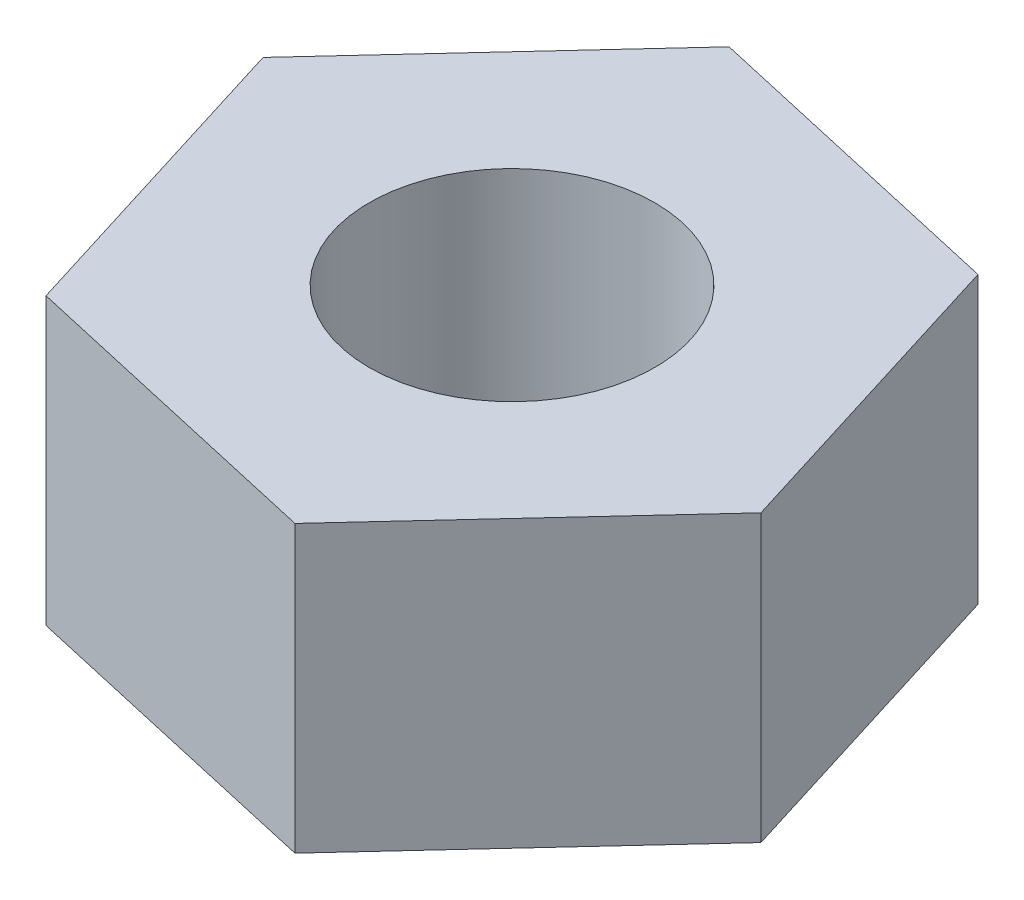
ISO-10303-21;
HEADER;
FILE_DESCRIPTION(('STEP AP214'),'2;1');
FILE_NAME('part.step','',(''),(''),'','','');
FILE_SCHEMA(('AUTOMOTIVE_DESIGN { 1 0 10303 214 1 1 1 1 }'));
ENDSEC;
DATA;
#1=APPLICATION_CONTEXT('core data for automotive mechanical design processes');
#2=APPLICATION_PROTOCOL_DEFINITION('international standard','automotive_design',2000,#1);
#3=PRODUCT_CONTEXT('',#1,'mechanical');
#4=PRODUCT('Part','Part','',(#3));
#5=PRODUCT_RELATED_PRODUCT_CATEGORY('part','',(#4));
#6=PRODUCT_DEFINITION_FORMATION('','',#4);
#7=PRODUCT_DEFINITION_CONTEXT('part definition',#1,'design');
#8=PRODUCT_DEFINITION('design','',#6,#7);
#9=PRODUCT_DEFINITION_SHAPE('','',#8);
#10=(LENGTH_UNIT() NAMED_UNIT(*) SI_UNIT(.MILLI.,.METRE.));
#11=(NAMED_UNIT(*) PLANE_ANGLE_UNIT() SI_UNIT($,.RADIAN.));
#12=(NAMED_UNIT(*) SI_UNIT($,.STERADIAN.) SOLID_ANGLE_UNIT());
#13=UNCERTAINTY_MEASURE_WITH_UNIT(LENGTH_MEASURE(1.E-05),#10,'distance_accuracy_value','');
#14=(GEOMETRIC_REPRESENTATION_CONTEXT(3) GLOBAL_UNCERTAINTY_ASSIGNED_CONTEXT((#13)) GLOBAL_UNIT_ASSIGNED_CONTEXT((#10,
#11,#12)) REPRESENTATION_CONTEXT('',''));
#15=CARTESIAN_POINT('',(0.,0.,0.));
#16=DIRECTION('',(0.,0.,1.));
#17=DIRECTION('',(1.,0.,0.));
#18=AXIS2_PLACEMENT_3D('',#15,#16,#17);
#19=CARTESIAN_POINT('',(-1.02792848073745,0.,-3.30807542817403));
#20=DIRECTION('',(0.220497439554603,0.,-0.97538755330887));
#21=DIRECTION('',(-0.97538755330887,0.,-0.220497439554603));
#22=AXIS2_PLACEMENT_3D('',#19,#20,#21);
#23=PLANE('',#22);
#24=DIRECTION('',(0.97538755330887,0.,0.220497439554603));
#25=VECTOR('',#24,1.);
#26=CARTESIAN_POINT('',(-1.02792848073745,-3.,-3.30807542817403));
#27=LINE('',#26,#25);
#28=CARTESIAN_POINT('',(-1.02792848073745,-3.,-3.30807542817403));
#29=VERTEX_POINT('',#28);
#30=CARTESIAN_POINT('',(2.35091311806507,-3.,-2.54424989167919));
#31=VERTEX_POINT('',#30);
#32=EDGE_CURVE('E118',#29,#31,#27,.T.);
#33=ORIENTED_EDGE('',*,*,#32,.F.);
#34=DIRECTION('',(0.,-1.,0.));
#35=VECTOR('',#34,1.);
#36=CARTESIAN_POINT('',(-1.02792848073745,0.,-3.30807542817403));
#37=LINE('',#36,#35);
#38=CARTESIAN_POINT('',(-1.02792848073745,0.,-3.30807542817403));
#39=VERTEX_POINT('',#38);
#40=EDGE_CURVE('E11',#39,#29,#37,.T.);
#41=ORIENTED_EDGE('',*,*,#40,.F.);
#42=DIRECTION('',(0.97538755330887,0.,0.220497439554603));
#43=VECTOR('',#42,1.);
#44=CARTESIAN_POINT('',(-1.02792848073745,0.,-3.30807542817403));
#45=LINE('',#44,#43);
#46=CARTESIAN_POINT('',(2.35091311806507,0.,-2.54424989167919));
#47=VERTEX_POINT('',#46);
#48=EDGE_CURVE('E133',#39,#47,#45,.T.);
#49=ORIENTED_EDGE('',*,*,#48,.T.);
#50=DIRECTION('',(0.,-1.,0.));
#51=VECTOR('',#50,1.);
#52=CARTESIAN_POINT('',(2.35091311806507,0.,-2.54424989167919));
#53=LINE('',#52,#51);
#54=EDGE_CURVE('E36',#47,#31,#53,.T.);
#55=ORIENTED_EDGE('',*,*,#54,.T.);
#56=EDGE_LOOP('',(#33,#41,#49,#55));
#57=FACE_BOUND('',#56,.T.);
#58=ADVANCED_FACE('F33',(#57),#23,.T.);
#59=CARTESIAN_POINT('',(-3.37884159880252,0.,-0.763825536494838));
#60=DIRECTION('',(-0.734461679923329,0.,-0.678650160778144));
#61=DIRECTION('',(-0.678650160778144,0.,0.734461679923329));
#62=AXIS2_PLACEMENT_3D('',#59,#60,#61);
#63=PLANE('',#62);
#64=DIRECTION('',(0.678650160778144,0.,-0.734461679923329));
#65=VECTOR('',#64,1.);
#66=CARTESIAN_POINT('',(-3.37884159880252,-3.,-0.763825536494838));
#67=LINE('',#66,#65);
#68=CARTESIAN_POINT('',(-3.37884159880252,-3.,-0.763825536494838));
#69=VERTEX_POINT('',#68);
#70=EDGE_CURVE('E131',#69,#29,#67,.T.);
#71=ORIENTED_EDGE('',*,*,#70,.F.);
#72=DIRECTION('',(0.,-1.,0.));
#73=VECTOR('',#72,1.);
#74=CARTESIAN_POINT('',(-3.37884159880252,0.,-0.763825536494838));
#75=LINE('',#74,#73);
#76=CARTESIAN_POINT('',(-3.37884159880252,0.,-0.763825536494838));
#77=VERTEX_POINT('',#76);
#78=EDGE_CURVE('E42',#77,#69,#75,.T.);
#79=ORIENTED_EDGE('',*,*,#78,.F.);
#80=DIRECTION('',(0.678650160778144,0.,-0.734461679923329));
#81=VECTOR('',#80,1.);
#82=CARTESIAN_POINT('',(-3.37884159880252,0.,-0.763825536494838));
#83=LINE('',#82,#81);
#84=EDGE_CURVE('E108',#77,#39,#83,.T.);
#85=ORIENTED_EDGE('',*,*,#84,.T.);
#86=ORIENTED_EDGE('',*,*,#40,.T.);
#87=EDGE_LOOP('',(#71,#79,#85,#86));
#88=FACE_BOUND('',#87,.T.);
#89=ADVANCED_FACE('F141',(#88),#63,.T.);
#90=CARTESIAN_POINT('',(-2.35091311806507,0.,2.54424989167919));
#91=DIRECTION('',(-0.954959119477931,0.,0.296737392530726));
#92=DIRECTION('',(0.296737392530726,0.,0.954959119477931));
#93=AXIS2_PLACEMENT_3D('',#90,#91,#92);
#94=PLANE('',#93);
#95=DIRECTION('',(-0.296737392530726,0.,-0.954959119477931));
#96=VECTOR('',#95,1.);
#97=CARTESIAN_POINT('',(-2.35091311806507,-3.,2.54424989167919));
#98=LINE('',#97,#96);
#99=CARTESIAN_POINT('',(-2.35091311806507,-3.,2.54424989167919));
#100=VERTEX_POINT('',#99);
#101=EDGE_CURVE('E95',#100,#69,#98,.T.);
#102=ORIENTED_EDGE('',*,*,#101,.F.);
#103=DIRECTION('',(0.,-1.,0.));
#104=VECTOR('',#103,1.);
#105=CARTESIAN_POINT('',(-2.35091311806507,0.,2.54424989167919));
#106=LINE('',#105,#104);
#107=CARTESIAN_POINT('',(-2.35091311806507,0.,2.54424989167919));
#108=VERTEX_POINT('',#107);
#109=EDGE_CURVE('E90',#108,#100,#106,.T.);
#110=ORIENTED_EDGE('',*,*,#109,.F.);
#111=DIRECTION('',(-0.296737392530726,0.,-0.954959119477931));
#112=VECTOR('',#111,1.);
#113=CARTESIAN_POINT('',(-2.35091311806507,0.,2.54424989167919));
#114=LINE('',#113,#112);
#115=EDGE_CURVE('E93',#108,#77,#114,.T.);
#116=ORIENTED_EDGE('',*,*,#115,.T.);
#117=ORIENTED_EDGE('',*,*,#78,.T.);
#118=EDGE_LOOP('',(#102,#110,#116,#117));
#119=FACE_BOUND('',#118,.T.);
#120=ADVANCED_FACE('F92',(#119),#94,.T.);
#121=CARTESIAN_POINT('',(1.02792848073745,0.,3.30807542817403));
#122=DIRECTION('',(-0.220497439554603,0.,0.97538755330887));
#123=DIRECTION('',(0.97538755330887,0.,0.220497439554603));
#124=AXIS2_PLACEMENT_3D('',#121,#122,#123);
#125=PLANE('',#124);
#126=DIRECTION('',(-0.97538755330887,0.,-0.220497439554603));
#127=VECTOR('',#126,1.);
#128=CARTESIAN_POINT('',(1.02792848073745,-3.,3.30807542817403));
#129=LINE('',#128,#127);
#130=CARTESIAN_POINT('',(1.02792848073745,-3.,3.30807542817403));
#131=VERTEX_POINT('',#130);
#132=EDGE_CURVE('E128',#131,#100,#129,.T.);
#133=ORIENTED_EDGE('',*,*,#132,.F.);
#134=DIRECTION('',(0.,-1.,0.));
#135=VECTOR('',#134,1.);
#136=CARTESIAN_POINT('',(1.02792848073745,0.,3.30807542817403));
#137=LINE('',#136,#135);
#138=CARTESIAN_POINT('',(1.02792848073745,0.,3.30807542817403));
#139=VERTEX_POINT('',#138);
#140=EDGE_CURVE('E100',#139,#131,#137,.T.);
#141=ORIENTED_EDGE('',*,*,#140,.F.);
#142=DIRECTION('',(-0.97538755330887,0.,-0.220497439554603));
#143=VECTOR('',#142,1.);
#144=CARTESIAN_POINT('',(1.02792848073745,0.,3.30807542817403));
#145=LINE('',#144,#143);
#146=EDGE_CURVE('E106',#139,#108,#145,.T.);
#147=ORIENTED_EDGE('',*,*,#146,.T.);
#148=ORIENTED_EDGE('',*,*,#109,.T.);
#149=EDGE_LOOP('',(#133,#141,#147,#148));
#150=FACE_BOUND('',#149,.T.);
#151=ADVANCED_FACE('F110',(#150),#125,.T.);
#152=CARTESIAN_POINT('',(3.37884159880252,0.,0.763825536494838));
#153=DIRECTION('',(0.734461679923329,0.,0.678650160778145));
#154=DIRECTION('',(0.678650160778145,0.,-0.734461679923329));
#155=AXIS2_PLACEMENT_3D('',#152,#153,#154);
#156=PLANE('',#155);
#157=DIRECTION('',(-0.678650160778145,0.,0.734461679923329));
#158=VECTOR('',#157,1.);
#159=CARTESIAN_POINT('',(3.37884159880252,-3.,0.763825536494838));
#160=LINE('',#159,#158);
#161=CARTESIAN_POINT('',(3.37884159880252,-3.,0.763825536494838));
#162=VERTEX_POINT('',#161);
#163=EDGE_CURVE('E125',#162,#131,#160,.T.);
#164=ORIENTED_EDGE('',*,*,#163,.F.);
#165=DIRECTION('',(0.,-1.,0.));
#166=VECTOR('',#165,1.);
#167=CARTESIAN_POINT('',(3.37884159880252,0.,0.763825536494838));
#168=LINE('',#167,#166);
#169=CARTESIAN_POINT('',(3.37884159880252,0.,0.763825536494838));
#170=VERTEX_POINT('',#169);
#171=EDGE_CURVE('E136',#170,#162,#168,.T.);
#172=ORIENTED_EDGE('',*,*,#171,.F.);
#173=DIRECTION('',(-0.678650160778145,0.,0.734461679923329));
#174=VECTOR('',#173,1.);
#175=CARTESIAN_POINT('',(3.37884159880252,0.,0.763825536494838));
#176=LINE('',#175,#174);
#177=EDGE_CURVE('E111',#170,#139,#176,.T.);
#178=ORIENTED_EDGE('',*,*,#177,.T.);
#179=ORIENTED_EDGE('',*,*,#140,.T.);
#180=EDGE_LOOP('',(#164,#172,#178,#179));
#181=FACE_BOUND('',#180,.T.);
#182=ADVANCED_FACE('F154',(#181),#156,.T.);
#183=CARTESIAN_POINT('',(2.35091311806507,0.,-2.54424989167919));
#184=DIRECTION('',(0.954959119477931,0.,-0.296737392530725));
#185=DIRECTION('',(-0.296737392530725,0.,-0.954959119477932));
#186=AXIS2_PLACEMENT_3D('',#183,#184,#185);
#187=PLANE('',#186);
#188=DIRECTION('',(0.296737392530725,0.,0.954959119477932));
#189=VECTOR('',#188,1.);
#190=CARTESIAN_POINT('',(2.35091311806507,-3.,-2.54424989167919));
#191=LINE('',#190,#189);
#192=EDGE_CURVE('E121',#31,#162,#191,.T.);
#193=ORIENTED_EDGE('',*,*,#192,.F.);
#194=ORIENTED_EDGE('',*,*,#54,.F.);
#195=DIRECTION('',(0.296737392530725,0.,0.954959119477932));
#196=VECTOR('',#195,1.);
#197=CARTESIAN_POINT('',(2.35091311806507,0.,-2.54424989167919));
#198=LINE('',#197,#196);
#199=EDGE_CURVE('E113',#47,#170,#198,.T.);
#200=ORIENTED_EDGE('',*,*,#199,.T.);
#201=ORIENTED_EDGE('',*,*,#171,.T.);
#202=EDGE_LOOP('',(#193,#194,#200,#201));
#203=FACE_BOUND('',#202,.T.);
#204=ADVANCED_FACE('F138',(#203),#187,.T.);
#205=CARTESIAN_POINT('',(0.,0.,0.));
#206=DIRECTION('',(0.,-1.,0.));
#207=DIRECTION('',(0.,0.,-1.));
#208=AXIS2_PLACEMENT_3D('',#205,#206,#207);
#209=PLANE('',#208);
#210=CARTESIAN_POINT('',(0.,0.,0.));
#211=DIRECTION('',(0.,-1.,0.));
#212=DIRECTION('',(0.,0.,1.));
#213=AXIS2_PLACEMENT_3D('',#210,#211,#212);
#214=CIRCLE('',#213,1.5);
#215=CARTESIAN_POINT('',(0.,0.,1.5));
#216=VERTEX_POINT('',#215);
#217=EDGE_CURVE('E122',#216,#216,#214,.T.);
#218=ORIENTED_EDGE('',*,*,#217,.T.);
#219=EDGE_LOOP('',(#218));
#220=FACE_BOUND('',#219,.T.);
#221=ORIENTED_EDGE('',*,*,#48,.F.);
#222=ORIENTED_EDGE('',*,*,#84,.F.);
#223=ORIENTED_EDGE('',*,*,#115,.F.);
#224=ORIENTED_EDGE('',*,*,#146,.F.);
#225=ORIENTED_EDGE('',*,*,#177,.F.);
#226=ORIENTED_EDGE('',*,*,#199,.F.);
#227=EDGE_LOOP('',(#221,#222,#223,#224,#225,#226));
#228=FACE_BOUND('',#227,.T.);
#229=ADVANCED_FACE('F104',(#220,#228),#209,.F.);
#230=CARTESIAN_POINT('',(0.,-3.,0.));
#231=DIRECTION('',(0.,-1.,0.));
#232=DIRECTION('',(0.,0.,-1.));
#233=AXIS2_PLACEMENT_3D('',#230,#231,#232);
#234=PLANE('',#233);
#235=CARTESIAN_POINT('',(0.,-3.,0.));
#236=DIRECTION('',(0.,-1.,0.));
#237=DIRECTION('',(0.,0.,1.));
#238=AXIS2_PLACEMENT_3D('',#235,#236,#237);
#239=CIRCLE('',#238,1.5);
#240=CARTESIAN_POINT('',(0.,-3.,1.5));
#241=VERTEX_POINT('',#240);
#242=EDGE_CURVE('E177',#241,#241,#239,.T.);
#243=ORIENTED_EDGE('',*,*,#242,.F.);
#244=EDGE_LOOP('',(#243));
#245=FACE_BOUND('',#244,.T.);
#246=ORIENTED_EDGE('',*,*,#32,.T.);
#247=ORIENTED_EDGE('',*,*,#192,.T.);
#248=ORIENTED_EDGE('',*,*,#163,.T.);
#249=ORIENTED_EDGE('',*,*,#132,.T.);
#250=ORIENTED_EDGE('',*,*,#101,.T.);
#251=ORIENTED_EDGE('',*,*,#70,.T.);
#252=EDGE_LOOP('',(#246,#247,#248,#249,#250,#251));
#253=FACE_BOUND('',#252,.T.);
#254=ADVANCED_FACE('F140',(#245,#253),#234,.T.);
#255=CARTESIAN_POINT('',(0.,0.,0.));
#256=DIRECTION('',(0.,-1.,0.));
#257=DIRECTION('',(0.,0.,-1.));
#258=AXIS2_PLACEMENT_3D('',#255,#256,#257);
#259=CYLINDRICAL_SURFACE('',#258,1.5);
#260=ORIENTED_EDGE('',*,*,#217,.F.);
#261=EDGE_LOOP('',(#260));
#262=FACE_BOUND('',#261,.T.);
#263=ORIENTED_EDGE('',*,*,#242,.T.);
#264=EDGE_LOOP('',(#263));
#265=FACE_BOUND('',#264,.T.);
#266=ADVANCED_FACE('F165',(#262,#265),#259,.F.);
#267=CLOSED_SHELL('',(#58,#89,#120,#151,#182,#204,#229,#254,#266));
#268=MANIFOLD_SOLID_BREP('B2',#267);
#269=ADVANCED_BREP_SHAPE_REPRESENTATION('',(#18,#268),#14);
#270=SHAPE_DEFINITION_REPRESENTATION(#9,#269);
ENDSEC;
END-ISO-10303-21;
